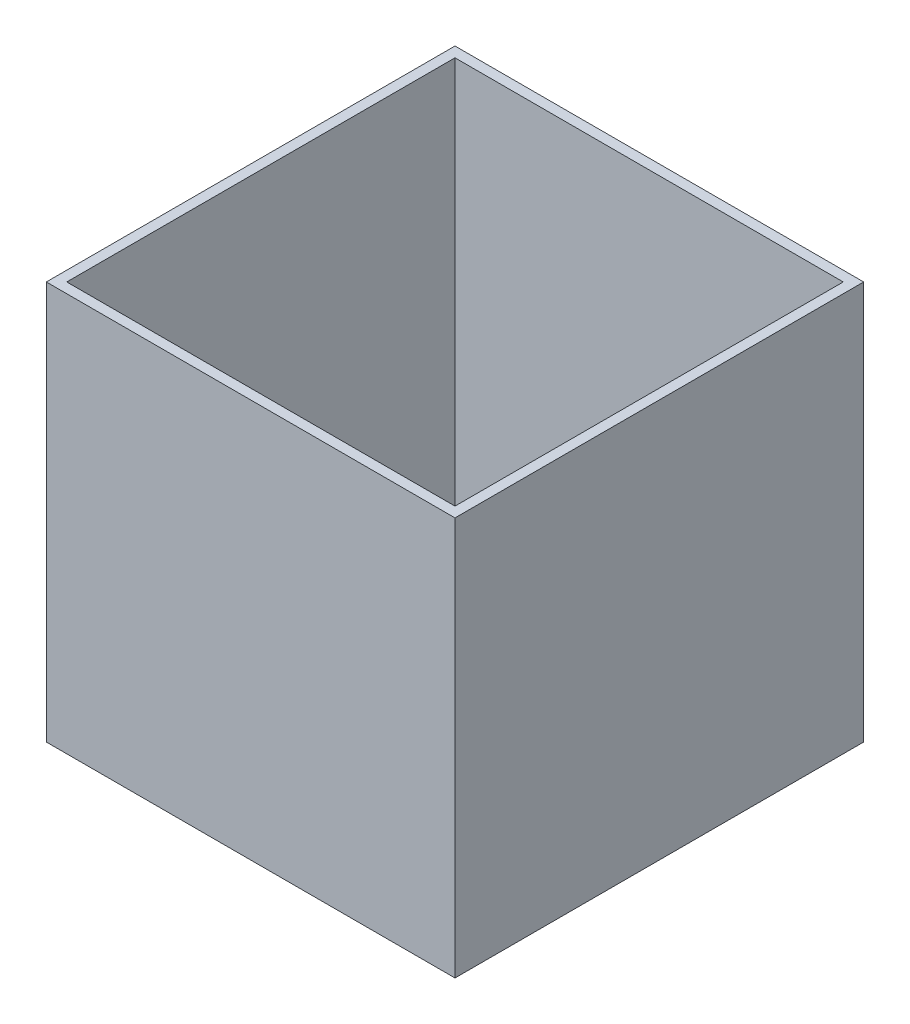
ISO-10303-21;
HEADER;
FILE_DESCRIPTION(('STEP AP214'),'2;1');
FILE_NAME('part.step','',(''),(''),'','','');
FILE_SCHEMA(('AUTOMOTIVE_DESIGN { 1 0 10303 214 1 1 1 1 }'));
ENDSEC;
DATA;
#1=APPLICATION_CONTEXT('core data for automotive mechanical design processes');
#2=APPLICATION_PROTOCOL_DEFINITION('international standard','automotive_design',2000,#1);
#3=PRODUCT_CONTEXT('',#1,'mechanical');
#4=PRODUCT('Part','Part','',(#3));
#5=PRODUCT_RELATED_PRODUCT_CATEGORY('part','',(#4));
#6=PRODUCT_DEFINITION_FORMATION('','',#4);
#7=PRODUCT_DEFINITION_CONTEXT('part definition',#1,'design');
#8=PRODUCT_DEFINITION('design','',#6,#7);
#9=PRODUCT_DEFINITION_SHAPE('','',#8);
#10=(LENGTH_UNIT() NAMED_UNIT(*) SI_UNIT(.MILLI.,.METRE.));
#11=(NAMED_UNIT(*) PLANE_ANGLE_UNIT() SI_UNIT($,.RADIAN.));
#12=(NAMED_UNIT(*) SI_UNIT($,.STERADIAN.) SOLID_ANGLE_UNIT());
#13=UNCERTAINTY_MEASURE_WITH_UNIT(LENGTH_MEASURE(1.E-05),#10,'distance_accuracy_value','');
#14=(GEOMETRIC_REPRESENTATION_CONTEXT(3) GLOBAL_UNCERTAINTY_ASSIGNED_CONTEXT((#13)) GLOBAL_UNIT_ASSIGNED_CONTEXT((#10,
#11,#12)) REPRESENTATION_CONTEXT('',''));
#15=CARTESIAN_POINT('',(0.,0.,0.));
#16=DIRECTION('',(0.,0.,1.));
#17=DIRECTION('',(1.,0.,0.));
#18=AXIS2_PLACEMENT_3D('',#15,#16,#17);
#19=CARTESIAN_POINT('',(40.,2.,-40.));
#20=DIRECTION('',(-1.,0.,0.));
#21=DIRECTION('',(0.,0.,1.));
#22=AXIS2_PLACEMENT_3D('',#19,#20,#21);
#23=PLANE('',#22);
#24=DIRECTION('',(0.,0.,-1.));
#25=VECTOR('',#24,1.);
#26=CARTESIAN_POINT('',(40.,0.,-40.));
#27=LINE('',#26,#25);
#28=CARTESIAN_POINT('',(40.,0.,40.));
#29=VERTEX_POINT('',#28);
#30=CARTESIAN_POINT('',(40.,0.,-40.));
#31=VERTEX_POINT('',#30);
#32=EDGE_CURVE('E210',#29,#31,#27,.T.);
#33=ORIENTED_EDGE('',*,*,#32,.T.);
#34=DIRECTION('',(0.,-1.,0.));
#35=VECTOR('',#34,1.);
#36=CARTESIAN_POINT('',(40.,-13.25,-40.));
#37=LINE('',#36,#35);
#38=CARTESIAN_POINT('',(40.,78.,-40.));
#39=VERTEX_POINT('',#38);
#40=EDGE_CURVE('E175',#39,#31,#37,.T.);
#41=ORIENTED_EDGE('',*,*,#40,.F.);
#42=DIRECTION('',(0.,0.,-1.));
#43=VECTOR('',#42,1.);
#44=CARTESIAN_POINT('',(40.,78.,-40.));
#45=LINE('',#44,#43);
#46=CARTESIAN_POINT('',(40.,78.,40.));
#47=VERTEX_POINT('',#46);
#48=EDGE_CURVE('E167',#47,#39,#45,.T.);
#49=ORIENTED_EDGE('',*,*,#48,.F.);
#50=DIRECTION('',(0.,-1.,0.));
#51=VECTOR('',#50,1.);
#52=CARTESIAN_POINT('',(40.,-13.25,40.));
#53=LINE('',#52,#51);
#54=EDGE_CURVE('E183',#47,#29,#53,.T.);
#55=ORIENTED_EDGE('',*,*,#54,.T.);
#56=EDGE_LOOP('',(#33,#41,#49,#55));
#57=FACE_BOUND('',#56,.T.);
#58=ADVANCED_FACE('F45',(#57),#23,.F.);
#59=CARTESIAN_POINT('',(0.,2.,0.));
#60=DIRECTION('',(0.,1.,0.));
#61=DIRECTION('',(0.,0.,1.));
#62=AXIS2_PLACEMENT_3D('',#59,#60,#61);
#63=PLANE('',#62);
#64=DIRECTION('',(0.,0.,1.));
#65=VECTOR('',#64,1.);
#66=CARTESIAN_POINT('',(-38.,2.,-38.));
#67=LINE('',#66,#65);
#68=CARTESIAN_POINT('',(-38.,2.,-38.));
#69=VERTEX_POINT('',#68);
#70=CARTESIAN_POINT('',(-38.,2.,38.));
#71=VERTEX_POINT('',#70);
#72=EDGE_CURVE('E62',#69,#71,#67,.T.);
#73=ORIENTED_EDGE('',*,*,#72,.T.);
#74=DIRECTION('',(1.,0.,0.));
#75=VECTOR('',#74,1.);
#76=CARTESIAN_POINT('',(38.,2.,38.));
#77=LINE('',#76,#75);
#78=CARTESIAN_POINT('',(38.,2.,38.));
#79=VERTEX_POINT('',#78);
#80=EDGE_CURVE('E66',#71,#79,#77,.T.);
#81=ORIENTED_EDGE('',*,*,#80,.T.);
#82=DIRECTION('',(0.,0.,-1.));
#83=VECTOR('',#82,1.);
#84=CARTESIAN_POINT('',(38.,2.,-38.));
#85=LINE('',#84,#83);
#86=CARTESIAN_POINT('',(38.,2.,-38.));
#87=VERTEX_POINT('',#86);
#88=EDGE_CURVE('E147',#79,#87,#85,.T.);
#89=ORIENTED_EDGE('',*,*,#88,.T.);
#90=DIRECTION('',(-1.,0.,0.));
#91=VECTOR('',#90,1.);
#92=CARTESIAN_POINT('',(38.,2.,-38.));
#93=LINE('',#92,#91);
#94=EDGE_CURVE('E122',#87,#69,#93,.T.);
#95=ORIENTED_EDGE('',*,*,#94,.T.);
#96=EDGE_LOOP('',(#73,#81,#89,#95));
#97=FACE_BOUND('',#96,.T.);
#98=CARTESIAN_POINT('',(-24.,2.,24.));
#99=DIRECTION('',(0.,-1.,0.));
#100=DIRECTION('',(0.,0.,-1.));
#101=AXIS2_PLACEMENT_3D('',#98,#99,#100);
#102=CIRCLE('',#101,2.2);
#103=CARTESIAN_POINT('',(-24.,2.,26.2));
#104=VERTEX_POINT('',#103);
#105=EDGE_CURVE('E189',#104,#104,#102,.T.);
#106=ORIENTED_EDGE('',*,*,#105,.T.);
#107=EDGE_LOOP('',(#106));
#108=FACE_BOUND('',#107,.T.);
#109=CARTESIAN_POINT('',(24.,2.,24.));
#110=DIRECTION('',(0.,-1.,0.));
#111=DIRECTION('',(0.,0.,-1.));
#112=AXIS2_PLACEMENT_3D('',#109,#110,#111);
#113=CIRCLE('',#112,2.2);
#114=CARTESIAN_POINT('',(24.,2.,26.2));
#115=VERTEX_POINT('',#114);
#116=EDGE_CURVE('E179',#115,#115,#113,.T.);
#117=ORIENTED_EDGE('',*,*,#116,.T.);
#118=EDGE_LOOP('',(#117));
#119=FACE_BOUND('',#118,.T.);
#120=CARTESIAN_POINT('',(-24.,2.,-24.));
#121=DIRECTION('',(0.,1.,0.));
#122=DIRECTION('',(0.,0.,1.));
#123=AXIS2_PLACEMENT_3D('',#120,#121,#122);
#124=CIRCLE('',#123,2.2);
#125=CARTESIAN_POINT('',(-24.,2.,-21.8));
#126=VERTEX_POINT('',#125);
#127=EDGE_CURVE('E197',#126,#126,#124,.T.);
#128=ORIENTED_EDGE('',*,*,#127,.F.);
#129=EDGE_LOOP('',(#128));
#130=FACE_BOUND('',#129,.T.);
#131=CARTESIAN_POINT('',(24.,2.,-24.));
#132=DIRECTION('',(0.,1.,0.));
#133=DIRECTION('',(0.,0.,1.));
#134=AXIS2_PLACEMENT_3D('',#131,#132,#133);
#135=CIRCLE('',#134,2.2);
#136=CARTESIAN_POINT('',(24.,2.,-21.8));
#137=VERTEX_POINT('',#136);
#138=EDGE_CURVE('E202',#137,#137,#135,.T.);
#139=ORIENTED_EDGE('',*,*,#138,.F.);
#140=EDGE_LOOP('',(#139));
#141=FACE_BOUND('',#140,.T.);
#142=CARTESIAN_POINT('',(0.,2.,0.));
#143=DIRECTION('',(0.,1.,0.));
#144=DIRECTION('',(0.,0.,1.));
#145=AXIS2_PLACEMENT_3D('',#142,#143,#144);
#146=CIRCLE('',#145,18.4);
#147=CARTESIAN_POINT('',(0.,2.,18.4));
#148=VERTEX_POINT('',#147);
#149=EDGE_CURVE('E206',#148,#148,#146,.T.);
#150=ORIENTED_EDGE('',*,*,#149,.F.);
#151=EDGE_LOOP('',(#150));
#152=FACE_BOUND('',#151,.T.);
#153=ADVANCED_FACE('F243',(#97,#108,#119,#130,#141,#152),#63,.T.);
#154=CARTESIAN_POINT('',(0.,0.,0.));
#155=DIRECTION('',(0.,1.,0.));
#156=DIRECTION('',(0.,0.,1.));
#157=AXIS2_PLACEMENT_3D('',#154,#155,#156);
#158=PLANE('',#157);
#159=CARTESIAN_POINT('',(-24.,0.,24.));
#160=DIRECTION('',(0.,1.,0.));
#161=DIRECTION('',(0.,0.,1.));
#162=AXIS2_PLACEMENT_3D('',#159,#160,#161);
#163=CIRCLE('',#162,2.2);
#164=CARTESIAN_POINT('',(-24.,0.,26.2));
#165=VERTEX_POINT('',#164);
#166=EDGE_CURVE('E48',#165,#165,#163,.F.);
#167=ORIENTED_EDGE('',*,*,#166,.F.);
#168=EDGE_LOOP('',(#167));
#169=FACE_BOUND('',#168,.T.);
#170=CARTESIAN_POINT('',(24.,0.,24.));
#171=DIRECTION('',(0.,1.,0.));
#172=DIRECTION('',(0.,0.,1.));
#173=AXIS2_PLACEMENT_3D('',#170,#171,#172);
#174=CIRCLE('',#173,2.2);
#175=CARTESIAN_POINT('',(24.,0.,26.2));
#176=VERTEX_POINT('',#175);
#177=EDGE_CURVE('E193',#176,#176,#174,.F.);
#178=ORIENTED_EDGE('',*,*,#177,.F.);
#179=EDGE_LOOP('',(#178));
#180=FACE_BOUND('',#179,.T.);
#181=CARTESIAN_POINT('',(-24.,0.,-24.));
#182=DIRECTION('',(0.,1.,0.));
#183=DIRECTION('',(0.,0.,1.));
#184=AXIS2_PLACEMENT_3D('',#181,#182,#183);
#185=CIRCLE('',#184,2.2);
#186=CARTESIAN_POINT('',(-24.,0.,-21.8));
#187=VERTEX_POINT('',#186);
#188=EDGE_CURVE('E215',#187,#187,#185,.T.);
#189=ORIENTED_EDGE('',*,*,#188,.T.);
#190=EDGE_LOOP('',(#189));
#191=FACE_BOUND('',#190,.T.);
#192=CARTESIAN_POINT('',(24.,0.,-24.));
#193=DIRECTION('',(0.,1.,0.));
#194=DIRECTION('',(0.,0.,1.));
#195=AXIS2_PLACEMENT_3D('',#192,#193,#194);
#196=CIRCLE('',#195,2.2);
#197=CARTESIAN_POINT('',(24.,0.,-21.8));
#198=VERTEX_POINT('',#197);
#199=EDGE_CURVE('E201',#198,#198,#196,.T.);
#200=ORIENTED_EDGE('',*,*,#199,.T.);
#201=EDGE_LOOP('',(#200));
#202=FACE_BOUND('',#201,.T.);
#203=ORIENTED_EDGE('',*,*,#32,.F.);
#204=DIRECTION('',(1.,0.,0.));
#205=VECTOR('',#204,1.);
#206=CARTESIAN_POINT('',(-40.,0.,40.));
#207=LINE('',#206,#205);
#208=CARTESIAN_POINT('',(-40.,0.,40.));
#209=VERTEX_POINT('',#208);
#210=EDGE_CURVE('E11',#209,#29,#207,.T.);
#211=ORIENTED_EDGE('',*,*,#210,.F.);
#212=DIRECTION('',(0.,0.,1.));
#213=VECTOR('',#212,1.);
#214=CARTESIAN_POINT('',(-40.,0.,-40.));
#215=LINE('',#214,#213);
#216=CARTESIAN_POINT('',(-40.,0.,-40.));
#217=VERTEX_POINT('',#216);
#218=EDGE_CURVE('E54',#217,#209,#215,.T.);
#219=ORIENTED_EDGE('',*,*,#218,.F.);
#220=DIRECTION('',(-1.,0.,0.));
#221=VECTOR('',#220,1.);
#222=CARTESIAN_POINT('',(-40.,0.,-40.));
#223=LINE('',#222,#221);
#224=EDGE_CURVE('E218',#31,#217,#223,.T.);
#225=ORIENTED_EDGE('',*,*,#224,.F.);
#226=EDGE_LOOP('',(#203,#211,#219,#225));
#227=FACE_BOUND('',#226,.T.);
#228=CARTESIAN_POINT('',(0.,0.,0.));
#229=DIRECTION('',(0.,1.,0.));
#230=DIRECTION('',(0.,0.,1.));
#231=AXIS2_PLACEMENT_3D('',#228,#229,#230);
#232=CIRCLE('',#231,18.4);
#233=CARTESIAN_POINT('',(0.,0.,18.4));
#234=VERTEX_POINT('',#233);
#235=EDGE_CURVE('E211',#234,#234,#232,.T.);
#236=ORIENTED_EDGE('',*,*,#235,.T.);
#237=EDGE_LOOP('',(#236));
#238=FACE_BOUND('',#237,.T.);
#239=ADVANCED_FACE('F239',(#169,#180,#191,#202,#227,#238),#158,.F.);
#240=CARTESIAN_POINT('',(-40.,2.,-40.));
#241=DIRECTION('',(0.,0.,1.));
#242=DIRECTION('',(1.,0.,0.));
#243=AXIS2_PLACEMENT_3D('',#240,#241,#242);
#244=PLANE('',#243);
#245=ORIENTED_EDGE('',*,*,#224,.T.);
#246=DIRECTION('',(0.,1.,0.));
#247=VECTOR('',#246,1.);
#248=CARTESIAN_POINT('',(-40.,-13.25,-40.));
#249=LINE('',#248,#247);
#250=CARTESIAN_POINT('',(-40.,78.,-40.));
#251=VERTEX_POINT('',#250);
#252=EDGE_CURVE('E176',#217,#251,#249,.T.);
#253=ORIENTED_EDGE('',*,*,#252,.T.);
#254=DIRECTION('',(-1.,0.,0.));
#255=VECTOR('',#254,1.);
#256=CARTESIAN_POINT('',(-40.,78.,-40.));
#257=LINE('',#256,#255);
#258=EDGE_CURVE('E171',#39,#251,#257,.T.);
#259=ORIENTED_EDGE('',*,*,#258,.F.);
#260=ORIENTED_EDGE('',*,*,#40,.T.);
#261=EDGE_LOOP('',(#245,#253,#259,#260));
#262=FACE_BOUND('',#261,.T.);
#263=ADVANCED_FACE('F242',(#262),#244,.F.);
#264=CARTESIAN_POINT('',(-40.,2.,-40.));
#265=DIRECTION('',(1.,0.,0.));
#266=DIRECTION('',(0.,0.,-1.));
#267=AXIS2_PLACEMENT_3D('',#264,#265,#266);
#268=PLANE('',#267);
#269=DIRECTION('',(0.,1.,0.));
#270=VECTOR('',#269,1.);
#271=CARTESIAN_POINT('',(-40.,-13.25,40.));
#272=LINE('',#271,#270);
#273=CARTESIAN_POINT('',(-40.,78.,40.));
#274=VERTEX_POINT('',#273);
#275=EDGE_CURVE('E180',#209,#274,#272,.T.);
#276=ORIENTED_EDGE('',*,*,#275,.T.);
#277=DIRECTION('',(0.,0.,1.));
#278=VECTOR('',#277,1.);
#279=CARTESIAN_POINT('',(-40.,78.,-40.));
#280=LINE('',#279,#278);
#281=EDGE_CURVE('E128',#251,#274,#280,.T.);
#282=ORIENTED_EDGE('',*,*,#281,.F.);
#283=ORIENTED_EDGE('',*,*,#252,.F.);
#284=ORIENTED_EDGE('',*,*,#218,.T.);
#285=EDGE_LOOP('',(#276,#282,#283,#284));
#286=FACE_BOUND('',#285,.T.);
#287=ADVANCED_FACE('F269',(#286),#268,.F.);
#288=CARTESIAN_POINT('',(-40.,2.,40.));
#289=DIRECTION('',(0.,0.,-1.));
#290=DIRECTION('',(-1.,0.,0.));
#291=AXIS2_PLACEMENT_3D('',#288,#289,#290);
#292=PLANE('',#291);
#293=ORIENTED_EDGE('',*,*,#54,.F.);
#294=DIRECTION('',(1.,0.,0.));
#295=VECTOR('',#294,1.);
#296=CARTESIAN_POINT('',(-40.,78.,40.));
#297=LINE('',#296,#295);
#298=EDGE_CURVE('E163',#274,#47,#297,.T.);
#299=ORIENTED_EDGE('',*,*,#298,.F.);
#300=ORIENTED_EDGE('',*,*,#275,.F.);
#301=ORIENTED_EDGE('',*,*,#210,.T.);
#302=EDGE_LOOP('',(#293,#299,#300,#301));
#303=FACE_BOUND('',#302,.T.);
#304=ADVANCED_FACE('F259',(#303),#292,.F.);
#305=CARTESIAN_POINT('',(0.,2.,0.));
#306=DIRECTION('',(0.,-1.,0.));
#307=DIRECTION('',(0.,0.,-1.));
#308=AXIS2_PLACEMENT_3D('',#305,#306,#307);
#309=CYLINDRICAL_SURFACE('',#308,18.4);
#310=ORIENTED_EDGE('',*,*,#149,.T.);
#311=EDGE_LOOP('',(#310));
#312=FACE_BOUND('',#311,.T.);
#313=ORIENTED_EDGE('',*,*,#235,.F.);
#314=EDGE_LOOP('',(#313));
#315=FACE_BOUND('',#314,.T.);
#316=ADVANCED_FACE('F256',(#312,#315),#309,.F.);
#317=CARTESIAN_POINT('',(24.,-13.25,-24.));
#318=DIRECTION('',(0.,1.,0.));
#319=DIRECTION('',(0.,0.,1.));
#320=AXIS2_PLACEMENT_3D('',#317,#318,#319);
#321=CYLINDRICAL_SURFACE('',#320,2.2);
#322=CARTESIAN_POINT('',(24.,2.,-21.8));
#323=CARTESIAN_POINT('',(24.,1.97916666666667,-21.8));
#324=CARTESIAN_POINT('',(24.,1.95833333333333,-21.8));
#325=CARTESIAN_POINT('',(24.,1.91666666666666,-21.8));
#326=CARTESIAN_POINT('',(24.,1.89583333333333,-21.8));
#327=CARTESIAN_POINT('',(24.,1.85416666666666,-21.8));
#328=CARTESIAN_POINT('',(24.,1.83333333333333,-21.8));
#329=CARTESIAN_POINT('',(24.,1.79166666666666,-21.8));
#330=CARTESIAN_POINT('',(24.,1.77083333333333,-21.8));
#331=CARTESIAN_POINT('',(24.,1.72916666666666,-21.8));
#332=CARTESIAN_POINT('',(24.,1.70833333333333,-21.8));
#333=CARTESIAN_POINT('',(24.,1.66666666666666,-21.8));
#334=CARTESIAN_POINT('',(24.,1.64583333333333,-21.8));
#335=CARTESIAN_POINT('',(24.,1.60416666666666,-21.8));
#336=CARTESIAN_POINT('',(24.,1.58333333333333,-21.8));
#337=CARTESIAN_POINT('',(24.,1.54166666666666,-21.8));
#338=CARTESIAN_POINT('',(24.,1.52083333333333,-21.8));
#339=CARTESIAN_POINT('',(24.,1.47916666666667,-21.8));
#340=CARTESIAN_POINT('',(24.,1.45833333333333,-21.8));
#341=CARTESIAN_POINT('',(24.,1.41666666666667,-21.8));
#342=CARTESIAN_POINT('',(24.,1.39583333333333,-21.8));
#343=CARTESIAN_POINT('',(24.,1.35416666666667,-21.8));
#344=CARTESIAN_POINT('',(24.,1.33333333333333,-21.8));
#345=CARTESIAN_POINT('',(24.,1.29166666666667,-21.8));
#346=CARTESIAN_POINT('',(24.,1.27083333333333,-21.8));
#347=CARTESIAN_POINT('',(24.,1.22916666666667,-21.8));
#348=CARTESIAN_POINT('',(24.,1.20833333333333,-21.8));
#349=CARTESIAN_POINT('',(24.,1.16666666666667,-21.8));
#350=CARTESIAN_POINT('',(24.,1.14583333333333,-21.8));
#351=CARTESIAN_POINT('',(24.,1.10416666666667,-21.8));
#352=CARTESIAN_POINT('',(24.,1.08333333333333,-21.8));
#353=CARTESIAN_POINT('',(24.,1.04166666666667,-21.8));
#354=CARTESIAN_POINT('',(24.,1.02083333333333,-21.8));
#355=CARTESIAN_POINT('',(24.,0.979166666666666,-21.8));
#356=CARTESIAN_POINT('',(24.,0.958333333333332,-21.8));
#357=CARTESIAN_POINT('',(24.,0.916666666666666,-21.8));
#358=CARTESIAN_POINT('',(24.,0.895833333333332,-21.8));
#359=CARTESIAN_POINT('',(24.,0.854166666666666,-21.8));
#360=CARTESIAN_POINT('',(24.,0.833333333333332,-21.8));
#361=CARTESIAN_POINT('',(24.,0.791666666666666,-21.8));
#362=CARTESIAN_POINT('',(24.,0.770833333333332,-21.8));
#363=CARTESIAN_POINT('',(24.,0.729166666666666,-21.8));
#364=CARTESIAN_POINT('',(24.,0.708333333333332,-21.8));
#365=CARTESIAN_POINT('',(24.,0.666666666666666,-21.8));
#366=CARTESIAN_POINT('',(24.,0.645833333333332,-21.8));
#367=CARTESIAN_POINT('',(24.,0.604166666666666,-21.8));
#368=CARTESIAN_POINT('',(24.,0.583333333333333,-21.8));
#369=CARTESIAN_POINT('',(24.,0.541666666666667,-21.8));
#370=CARTESIAN_POINT('',(24.,0.520833333333334,-21.8));
#371=CARTESIAN_POINT('',(24.,0.479166666666667,-21.8));
#372=CARTESIAN_POINT('',(24.,0.458333333333334,-21.8));
#373=CARTESIAN_POINT('',(24.,0.416666666666667,-21.8));
#374=CARTESIAN_POINT('',(24.,0.395833333333334,-21.8));
#375=CARTESIAN_POINT('',(24.,0.354166666666667,-21.8));
#376=CARTESIAN_POINT('',(24.,0.333333333333334,-21.8));
#377=CARTESIAN_POINT('',(24.,0.291666666666667,-21.8));
#378=CARTESIAN_POINT('',(24.,0.270833333333334,-21.8));
#379=CARTESIAN_POINT('',(24.,0.229166666666667,-21.8));
#380=CARTESIAN_POINT('',(24.,0.208333333333334,-21.8));
#381=CARTESIAN_POINT('',(24.,0.166666666666667,-21.8));
#382=CARTESIAN_POINT('',(24.,0.145833333333333,-21.8));
#383=CARTESIAN_POINT('',(24.,0.104166666666667,-21.8));
#384=CARTESIAN_POINT('',(24.,0.0833333333333334,-21.8));
#385=CARTESIAN_POINT('',(24.,0.0416666666666667,-21.8));
#386=CARTESIAN_POINT('',(24.,0.0208333333333333,-21.8));
#387=CARTESIAN_POINT('',(24.,0.,-21.8));
#388=B_SPLINE_CURVE_WITH_KNOTS('',3,(#322,#323,#324,#325,#326,#327,#328,#329,#330,#331,#332,
#333,#334,#335,#336,#337,#338,#339,#340,#341,#342,#343,#344,#345,#346,#347,#348,#349,#350,#351,
#352,#353,#354,#355,#356,#357,#358,#359,#360,#361,#362,#363,#364,#365,#366,#367,#368,#369,#370,
#371,#372,#373,#374,#375,#376,#377,#378,#379,#380,#381,#382,#383,#384,#385,#386,#387),
.UNSPECIFIED.,.F.,.F.,(4,2,2,2,2,2,2,2,2,2,2,2,2,2,2,2,2,2,2,2,2,2,2,2,2,2,2,2,2,2,2,2,4),(0.,
0.0625000000000001,0.125,0.1875,0.25,0.3125,0.375,0.4375,0.5,0.562499999999999,
0.624999999999999,0.687499999999999,0.749999999999999,0.812499999999999,0.874999999999999,
0.937499999999999,0.999999999999999,1.0625,1.125,1.1875,1.25,1.3125,1.375,1.4375,1.5,1.5625,
1.625,1.6875,1.75,1.8125,1.875,1.9375,2.),.UNSPECIFIED.);
#389=EDGE_CURVE('BSEAM258',#137,#198,#388,.T.);
#390=ORIENTED_EDGE('',*,*,#138,.T.);
#391=ORIENTED_EDGE('',*,*,#199,.F.);
#392=ORIENTED_EDGE('',*,*,#389,.T.);
#393=ORIENTED_EDGE('',*,*,#389,.F.);
#394=EDGE_LOOP('',(#390,#392,#391,#393));
#395=FACE_BOUND('',#394,.T.);
#396=ADVANCED_FACE('F258',(#395),#321,.F.);
#397=CARTESIAN_POINT('',(-24.,-13.25,-24.));
#398=DIRECTION('',(0.,1.,0.));
#399=DIRECTION('',(0.,0.,1.));
#400=AXIS2_PLACEMENT_3D('',#397,#398,#399);
#401=CYLINDRICAL_SURFACE('',#400,2.2);
#402=CARTESIAN_POINT('',(-24.,2.,-21.8));
#403=CARTESIAN_POINT('',(-24.,1.97916666666667,-21.8));
#404=CARTESIAN_POINT('',(-24.,1.95833333333333,-21.8));
#405=CARTESIAN_POINT('',(-24.,1.91666666666666,-21.8));
#406=CARTESIAN_POINT('',(-24.,1.89583333333333,-21.8));
#407=CARTESIAN_POINT('',(-24.,1.85416666666666,-21.8));
#408=CARTESIAN_POINT('',(-24.,1.83333333333333,-21.8));
#409=CARTESIAN_POINT('',(-24.,1.79166666666666,-21.8));
#410=CARTESIAN_POINT('',(-24.,1.77083333333333,-21.8));
#411=CARTESIAN_POINT('',(-24.,1.72916666666666,-21.8));
#412=CARTESIAN_POINT('',(-24.,1.70833333333333,-21.8));
#413=CARTESIAN_POINT('',(-24.,1.66666666666666,-21.8));
#414=CARTESIAN_POINT('',(-24.,1.64583333333333,-21.8));
#415=CARTESIAN_POINT('',(-24.,1.60416666666666,-21.8));
#416=CARTESIAN_POINT('',(-24.,1.58333333333333,-21.8));
#417=CARTESIAN_POINT('',(-24.,1.54166666666666,-21.8));
#418=CARTESIAN_POINT('',(-24.,1.52083333333333,-21.8));
#419=CARTESIAN_POINT('',(-24.,1.47916666666667,-21.8));
#420=CARTESIAN_POINT('',(-24.,1.45833333333333,-21.8));
#421=CARTESIAN_POINT('',(-24.,1.41666666666667,-21.8));
#422=CARTESIAN_POINT('',(-24.,1.39583333333333,-21.8));
#423=CARTESIAN_POINT('',(-24.,1.35416666666667,-21.8));
#424=CARTESIAN_POINT('',(-24.,1.33333333333333,-21.8));
#425=CARTESIAN_POINT('',(-24.,1.29166666666667,-21.8));
#426=CARTESIAN_POINT('',(-24.,1.27083333333333,-21.8));
#427=CARTESIAN_POINT('',(-24.,1.22916666666667,-21.8));
#428=CARTESIAN_POINT('',(-24.,1.20833333333333,-21.8));
#429=CARTESIAN_POINT('',(-24.,1.16666666666667,-21.8));
#430=CARTESIAN_POINT('',(-24.,1.14583333333333,-21.8));
#431=CARTESIAN_POINT('',(-24.,1.10416666666667,-21.8));
#432=CARTESIAN_POINT('',(-24.,1.08333333333333,-21.8));
#433=CARTESIAN_POINT('',(-24.,1.04166666666667,-21.8));
#434=CARTESIAN_POINT('',(-24.,1.02083333333333,-21.8));
#435=CARTESIAN_POINT('',(-24.,0.979166666666666,-21.8));
#436=CARTESIAN_POINT('',(-24.,0.958333333333332,-21.8));
#437=CARTESIAN_POINT('',(-24.,0.916666666666666,-21.8));
#438=CARTESIAN_POINT('',(-24.,0.895833333333332,-21.8));
#439=CARTESIAN_POINT('',(-24.,0.854166666666666,-21.8));
#440=CARTESIAN_POINT('',(-24.,0.833333333333332,-21.8));
#441=CARTESIAN_POINT('',(-24.,0.791666666666666,-21.8));
#442=CARTESIAN_POINT('',(-24.,0.770833333333332,-21.8));
#443=CARTESIAN_POINT('',(-24.,0.729166666666666,-21.8));
#444=CARTESIAN_POINT('',(-24.,0.708333333333332,-21.8));
#445=CARTESIAN_POINT('',(-24.,0.666666666666666,-21.8));
#446=CARTESIAN_POINT('',(-24.,0.645833333333332,-21.8));
#447=CARTESIAN_POINT('',(-24.,0.604166666666666,-21.8));
#448=CARTESIAN_POINT('',(-24.,0.583333333333333,-21.8));
#449=CARTESIAN_POINT('',(-24.,0.541666666666667,-21.8));
#450=CARTESIAN_POINT('',(-24.,0.520833333333334,-21.8));
#451=CARTESIAN_POINT('',(-24.,0.479166666666667,-21.8));
#452=CARTESIAN_POINT('',(-24.,0.458333333333334,-21.8));
#453=CARTESIAN_POINT('',(-24.,0.416666666666667,-21.8));
#454=CARTESIAN_POINT('',(-24.,0.395833333333334,-21.8));
#455=CARTESIAN_POINT('',(-24.,0.354166666666667,-21.8));
#456=CARTESIAN_POINT('',(-24.,0.333333333333334,-21.8));
#457=CARTESIAN_POINT('',(-24.,0.291666666666667,-21.8));
#458=CARTESIAN_POINT('',(-24.,0.270833333333334,-21.8));
#459=CARTESIAN_POINT('',(-24.,0.229166666666667,-21.8));
#460=CARTESIAN_POINT('',(-24.,0.208333333333334,-21.8));
#461=CARTESIAN_POINT('',(-24.,0.166666666666667,-21.8));
#462=CARTESIAN_POINT('',(-24.,0.145833333333333,-21.8));
#463=CARTESIAN_POINT('',(-24.,0.104166666666667,-21.8));
#464=CARTESIAN_POINT('',(-24.,0.0833333333333334,-21.8));
#465=CARTESIAN_POINT('',(-24.,0.0416666666666667,-21.8));
#466=CARTESIAN_POINT('',(-24.,0.0208333333333333,-21.8));
#467=CARTESIAN_POINT('',(-24.,0.,-21.8));
#468=B_SPLINE_CURVE_WITH_KNOTS('',3,(#402,#403,#404,#405,#406,#407,#408,#409,#410,#411,#412,
#413,#414,#415,#416,#417,#418,#419,#420,#421,#422,#423,#424,#425,#426,#427,#428,#429,#430,#431,
#432,#433,#434,#435,#436,#437,#438,#439,#440,#441,#442,#443,#444,#445,#446,#447,#448,#449,#450,
#451,#452,#453,#454,#455,#456,#457,#458,#459,#460,#461,#462,#463,#464,#465,#466,#467),
.UNSPECIFIED.,.F.,.F.,(4,2,2,2,2,2,2,2,2,2,2,2,2,2,2,2,2,2,2,2,2,2,2,2,2,2,2,2,2,2,2,2,4),(0.,
0.0625000000000001,0.125,0.1875,0.25,0.3125,0.375,0.4375,0.5,0.562499999999999,
0.624999999999999,0.687499999999999,0.749999999999999,0.812499999999999,0.874999999999999,
0.937499999999999,0.999999999999999,1.0625,1.125,1.1875,1.25,1.3125,1.375,1.4375,1.5,1.5625,
1.625,1.6875,1.75,1.8125,1.875,1.9375,2.),.UNSPECIFIED.);
#469=EDGE_CURVE('BSEAM265',#126,#187,#468,.T.);
#470=ORIENTED_EDGE('',*,*,#127,.T.);
#471=ORIENTED_EDGE('',*,*,#188,.F.);
#472=ORIENTED_EDGE('',*,*,#469,.T.);
#473=ORIENTED_EDGE('',*,*,#469,.F.);
#474=EDGE_LOOP('',(#470,#472,#471,#473));
#475=FACE_BOUND('',#474,.T.);
#476=ADVANCED_FACE('F265',(#475),#401,.F.);
#477=CARTESIAN_POINT('',(24.,-13.25,24.));
#478=DIRECTION('',(0.,1.,0.));
#479=DIRECTION('',(0.,0.,1.));
#480=AXIS2_PLACEMENT_3D('',#477,#478,#479);
#481=CYLINDRICAL_SURFACE('',#480,2.2);
#482=CARTESIAN_POINT('',(24.,2.,26.2));
#483=CARTESIAN_POINT('',(24.,1.97916666666667,26.2));
#484=CARTESIAN_POINT('',(24.,1.95833333333334,26.2));
#485=CARTESIAN_POINT('',(24.,1.91666666666667,26.2));
#486=CARTESIAN_POINT('',(24.,1.89583333333334,26.2));
#487=CARTESIAN_POINT('',(24.,1.85416666666667,26.2));
#488=CARTESIAN_POINT('',(24.,1.83333333333334,26.2));
#489=CARTESIAN_POINT('',(24.,1.79166666666667,26.2));
#490=CARTESIAN_POINT('',(24.,1.77083333333334,26.2));
#491=CARTESIAN_POINT('',(24.,1.72916666666667,26.2));
#492=CARTESIAN_POINT('',(24.,1.70833333333333,26.2));
#493=CARTESIAN_POINT('',(24.,1.66666666666667,26.2));
#494=CARTESIAN_POINT('',(24.,1.64583333333333,26.2));
#495=CARTESIAN_POINT('',(24.,1.60416666666667,26.2));
#496=CARTESIAN_POINT('',(24.,1.58333333333333,26.2));
#497=CARTESIAN_POINT('',(24.,1.54166666666667,26.2));
#498=CARTESIAN_POINT('',(24.,1.52083333333333,26.2));
#499=CARTESIAN_POINT('',(24.,1.47916666666667,26.2));
#500=CARTESIAN_POINT('',(24.,1.45833333333333,26.2));
#501=CARTESIAN_POINT('',(24.,1.41666666666667,26.2));
#502=CARTESIAN_POINT('',(24.,1.39583333333333,26.2));
#503=CARTESIAN_POINT('',(24.,1.35416666666667,26.2));
#504=CARTESIAN_POINT('',(24.,1.33333333333333,26.2));
#505=CARTESIAN_POINT('',(24.,1.29166666666667,26.2));
#506=CARTESIAN_POINT('',(24.,1.27083333333333,26.2));
#507=CARTESIAN_POINT('',(24.,1.22916666666667,26.2));
#508=CARTESIAN_POINT('',(24.,1.20833333333333,26.2));
#509=CARTESIAN_POINT('',(24.,1.16666666666667,26.2));
#510=CARTESIAN_POINT('',(24.,1.14583333333333,26.2));
#511=CARTESIAN_POINT('',(24.,1.10416666666667,26.2));
#512=CARTESIAN_POINT('',(24.,1.08333333333333,26.2));
#513=CARTESIAN_POINT('',(24.,1.04166666666667,26.2));
#514=CARTESIAN_POINT('',(24.,1.02083333333333,26.2));
#515=CARTESIAN_POINT('',(24.,0.979166666666668,26.2));
#516=CARTESIAN_POINT('',(24.,0.958333333333334,26.2));
#517=CARTESIAN_POINT('',(24.,0.916666666666668,26.2));
#518=CARTESIAN_POINT('',(24.,0.895833333333334,26.2));
#519=CARTESIAN_POINT('',(24.,0.854166666666667,26.2));
#520=CARTESIAN_POINT('',(24.,0.833333333333334,26.2));
#521=CARTESIAN_POINT('',(24.,0.791666666666667,26.2));
#522=CARTESIAN_POINT('',(24.,0.770833333333334,26.2));
#523=CARTESIAN_POINT('',(24.,0.729166666666667,26.2));
#524=CARTESIAN_POINT('',(24.,0.708333333333334,26.2));
#525=CARTESIAN_POINT('',(24.,0.666666666666667,26.2));
#526=CARTESIAN_POINT('',(24.,0.645833333333334,26.2));
#527=CARTESIAN_POINT('',(24.,0.604166666666667,26.2));
#528=CARTESIAN_POINT('',(24.,0.583333333333334,26.2));
#529=CARTESIAN_POINT('',(24.,0.541666666666667,26.2));
#530=CARTESIAN_POINT('',(24.,0.520833333333334,26.2));
#531=CARTESIAN_POINT('',(24.,0.479166666666667,26.2));
#532=CARTESIAN_POINT('',(24.,0.458333333333334,26.2));
#533=CARTESIAN_POINT('',(24.,0.416666666666667,26.2));
#534=CARTESIAN_POINT('',(24.,0.395833333333334,26.2));
#535=CARTESIAN_POINT('',(24.,0.354166666666667,26.2));
#536=CARTESIAN_POINT('',(24.,0.333333333333334,26.2));
#537=CARTESIAN_POINT('',(24.,0.291666666666667,26.2));
#538=CARTESIAN_POINT('',(24.,0.270833333333334,26.2));
#539=CARTESIAN_POINT('',(24.,0.229166666666667,26.2));
#540=CARTESIAN_POINT('',(24.,0.208333333333334,26.2));
#541=CARTESIAN_POINT('',(24.,0.166666666666667,26.2));
#542=CARTESIAN_POINT('',(24.,0.145833333333333,26.2));
#543=CARTESIAN_POINT('',(24.,0.104166666666667,26.2));
#544=CARTESIAN_POINT('',(24.,0.0833333333333334,26.2));
#545=CARTESIAN_POINT('',(24.,0.0416666666666667,26.2));
#546=CARTESIAN_POINT('',(24.,0.0208333333333333,26.2));
#547=CARTESIAN_POINT('',(24.,0.,26.2));
#548=B_SPLINE_CURVE_WITH_KNOTS('',3,(#482,#483,#484,#485,#486,#487,#488,#489,#490,#491,#492,
#493,#494,#495,#496,#497,#498,#499,#500,#501,#502,#503,#504,#505,#506,#507,#508,#509,#510,#511,
#512,#513,#514,#515,#516,#517,#518,#519,#520,#521,#522,#523,#524,#525,#526,#527,#528,#529,#530,
#531,#532,#533,#534,#535,#536,#537,#538,#539,#540,#541,#542,#543,#544,#545,#546,#547),
.UNSPECIFIED.,.F.,.F.,(4,2,2,2,2,2,2,2,2,2,2,2,2,2,2,2,2,2,2,2,2,2,2,2,2,2,2,2,2,2,2,2,4),(0.,
0.0625000000000001,0.125,0.1875,0.25,0.3125,0.375,0.4375,0.5,0.5625,0.625000000000001,
0.687500000000001,0.750000000000001,0.812500000000001,0.875000000000001,0.937500000000001,1.,
1.0625,1.125,1.1875,1.25,1.3125,1.375,1.4375,1.5,1.5625,1.625,1.6875,1.75,1.8125,1.875,1.9375,
2.),.UNSPECIFIED.);
#549=EDGE_CURVE('BSEAM294',#115,#176,#548,.T.);
#550=ORIENTED_EDGE('',*,*,#116,.F.);
#551=ORIENTED_EDGE('',*,*,#177,.T.);
#552=ORIENTED_EDGE('',*,*,#549,.T.);
#553=ORIENTED_EDGE('',*,*,#549,.F.);
#554=EDGE_LOOP('',(#550,#552,#551,#553));
#555=FACE_BOUND('',#554,.T.);
#556=ADVANCED_FACE('F294',(#555),#481,.F.);
#557=CARTESIAN_POINT('',(-24.,-13.25,24.));
#558=DIRECTION('',(0.,1.,0.));
#559=DIRECTION('',(0.,0.,1.));
#560=AXIS2_PLACEMENT_3D('',#557,#558,#559);
#561=CYLINDRICAL_SURFACE('',#560,2.2);
#562=CARTESIAN_POINT('',(-24.,2.,26.2));
#563=CARTESIAN_POINT('',(-24.,1.97916666666667,26.2));
#564=CARTESIAN_POINT('',(-24.,1.95833333333334,26.2));
#565=CARTESIAN_POINT('',(-24.,1.91666666666667,26.2));
#566=CARTESIAN_POINT('',(-24.,1.89583333333334,26.2));
#567=CARTESIAN_POINT('',(-24.,1.85416666666667,26.2));
#568=CARTESIAN_POINT('',(-24.,1.83333333333334,26.2));
#569=CARTESIAN_POINT('',(-24.,1.79166666666667,26.2));
#570=CARTESIAN_POINT('',(-24.,1.77083333333334,26.2));
#571=CARTESIAN_POINT('',(-24.,1.72916666666667,26.2));
#572=CARTESIAN_POINT('',(-24.,1.70833333333333,26.2));
#573=CARTESIAN_POINT('',(-24.,1.66666666666667,26.2));
#574=CARTESIAN_POINT('',(-24.,1.64583333333333,26.2));
#575=CARTESIAN_POINT('',(-24.,1.60416666666667,26.2));
#576=CARTESIAN_POINT('',(-24.,1.58333333333333,26.2));
#577=CARTESIAN_POINT('',(-24.,1.54166666666667,26.2));
#578=CARTESIAN_POINT('',(-24.,1.52083333333333,26.2));
#579=CARTESIAN_POINT('',(-24.,1.47916666666667,26.2));
#580=CARTESIAN_POINT('',(-24.,1.45833333333333,26.2));
#581=CARTESIAN_POINT('',(-24.,1.41666666666667,26.2));
#582=CARTESIAN_POINT('',(-24.,1.39583333333333,26.2));
#583=CARTESIAN_POINT('',(-24.,1.35416666666667,26.2));
#584=CARTESIAN_POINT('',(-24.,1.33333333333333,26.2));
#585=CARTESIAN_POINT('',(-24.,1.29166666666667,26.2));
#586=CARTESIAN_POINT('',(-24.,1.27083333333333,26.2));
#587=CARTESIAN_POINT('',(-24.,1.22916666666667,26.2));
#588=CARTESIAN_POINT('',(-24.,1.20833333333333,26.2));
#589=CARTESIAN_POINT('',(-24.,1.16666666666667,26.2));
#590=CARTESIAN_POINT('',(-24.,1.14583333333333,26.2));
#591=CARTESIAN_POINT('',(-24.,1.10416666666667,26.2));
#592=CARTESIAN_POINT('',(-24.,1.08333333333333,26.2));
#593=CARTESIAN_POINT('',(-24.,1.04166666666667,26.2));
#594=CARTESIAN_POINT('',(-24.,1.02083333333333,26.2));
#595=CARTESIAN_POINT('',(-24.,0.979166666666668,26.2));
#596=CARTESIAN_POINT('',(-24.,0.958333333333334,26.2));
#597=CARTESIAN_POINT('',(-24.,0.916666666666668,26.2));
#598=CARTESIAN_POINT('',(-24.,0.895833333333334,26.2));
#599=CARTESIAN_POINT('',(-24.,0.854166666666667,26.2));
#600=CARTESIAN_POINT('',(-24.,0.833333333333334,26.2));
#601=CARTESIAN_POINT('',(-24.,0.791666666666667,26.2));
#602=CARTESIAN_POINT('',(-24.,0.770833333333334,26.2));
#603=CARTESIAN_POINT('',(-24.,0.729166666666667,26.2));
#604=CARTESIAN_POINT('',(-24.,0.708333333333334,26.2));
#605=CARTESIAN_POINT('',(-24.,0.666666666666667,26.2));
#606=CARTESIAN_POINT('',(-24.,0.645833333333334,26.2));
#607=CARTESIAN_POINT('',(-24.,0.604166666666667,26.2));
#608=CARTESIAN_POINT('',(-24.,0.583333333333334,26.2));
#609=CARTESIAN_POINT('',(-24.,0.541666666666667,26.2));
#610=CARTESIAN_POINT('',(-24.,0.520833333333334,26.2));
#611=CARTESIAN_POINT('',(-24.,0.479166666666667,26.2));
#612=CARTESIAN_POINT('',(-24.,0.458333333333334,26.2));
#613=CARTESIAN_POINT('',(-24.,0.416666666666667,26.2));
#614=CARTESIAN_POINT('',(-24.,0.395833333333334,26.2));
#615=CARTESIAN_POINT('',(-24.,0.354166666666667,26.2));
#616=CARTESIAN_POINT('',(-24.,0.333333333333334,26.2));
#617=CARTESIAN_POINT('',(-24.,0.291666666666667,26.2));
#618=CARTESIAN_POINT('',(-24.,0.270833333333334,26.2));
#619=CARTESIAN_POINT('',(-24.,0.229166666666667,26.2));
#620=CARTESIAN_POINT('',(-24.,0.208333333333334,26.2));
#621=CARTESIAN_POINT('',(-24.,0.166666666666667,26.2));
#622=CARTESIAN_POINT('',(-24.,0.145833333333333,26.2));
#623=CARTESIAN_POINT('',(-24.,0.104166666666667,26.2));
#624=CARTESIAN_POINT('',(-24.,0.0833333333333334,26.2));
#625=CARTESIAN_POINT('',(-24.,0.0416666666666667,26.2));
#626=CARTESIAN_POINT('',(-24.,0.0208333333333333,26.2));
#627=CARTESIAN_POINT('',(-24.,0.,26.2));
#628=B_SPLINE_CURVE_WITH_KNOTS('',3,(#562,#563,#564,#565,#566,#567,#568,#569,#570,#571,#572,
#573,#574,#575,#576,#577,#578,#579,#580,#581,#582,#583,#584,#585,#586,#587,#588,#589,#590,#591,
#592,#593,#594,#595,#596,#597,#598,#599,#600,#601,#602,#603,#604,#605,#606,#607,#608,#609,#610,
#611,#612,#613,#614,#615,#616,#617,#618,#619,#620,#621,#622,#623,#624,#625,#626,#627),
.UNSPECIFIED.,.F.,.F.,(4,2,2,2,2,2,2,2,2,2,2,2,2,2,2,2,2,2,2,2,2,2,2,2,2,2,2,2,2,2,2,2,4),(0.,
0.0625000000000001,0.125,0.1875,0.25,0.3125,0.375,0.4375,0.5,0.5625,0.625000000000001,
0.687500000000001,0.750000000000001,0.812500000000001,0.875000000000001,0.937500000000001,1.,
1.0625,1.125,1.1875,1.25,1.3125,1.375,1.4375,1.5,1.5625,1.625,1.6875,1.75,1.8125,1.875,1.9375,
2.),.UNSPECIFIED.);
#629=EDGE_CURVE('BSEAM237',#104,#165,#628,.T.);
#630=ORIENTED_EDGE('',*,*,#105,.F.);
#631=ORIENTED_EDGE('',*,*,#166,.T.);
#632=ORIENTED_EDGE('',*,*,#629,.T.);
#633=ORIENTED_EDGE('',*,*,#629,.F.);
#634=EDGE_LOOP('',(#630,#632,#631,#633));
#635=FACE_BOUND('',#634,.T.);
#636=ADVANCED_FACE('F237',(#635),#561,.F.);
#637=CARTESIAN_POINT('',(0.,78.,0.));
#638=DIRECTION('',(0.,1.,0.));
#639=DIRECTION('',(0.,0.,1.));
#640=AXIS2_PLACEMENT_3D('',#637,#638,#639);
#641=PLANE('',#640);
#642=ORIENTED_EDGE('',*,*,#281,.T.);
#643=ORIENTED_EDGE('',*,*,#298,.T.);
#644=ORIENTED_EDGE('',*,*,#48,.T.);
#645=ORIENTED_EDGE('',*,*,#258,.T.);
#646=EDGE_LOOP('',(#642,#643,#644,#645));
#647=FACE_BOUND('',#646,.T.);
#648=DIRECTION('',(1.,0.,0.));
#649=VECTOR('',#648,1.);
#650=CARTESIAN_POINT('',(38.,78.,38.));
#651=LINE('',#650,#649);
#652=CARTESIAN_POINT('',(-38.,78.,38.));
#653=VERTEX_POINT('',#652);
#654=CARTESIAN_POINT('',(38.,78.,38.));
#655=VERTEX_POINT('',#654);
#656=EDGE_CURVE('E121',#653,#655,#651,.T.);
#657=ORIENTED_EDGE('',*,*,#656,.F.);
#658=DIRECTION('',(0.,0.,1.));
#659=VECTOR('',#658,1.);
#660=CARTESIAN_POINT('',(-38.,78.,-38.));
#661=LINE('',#660,#659);
#662=CARTESIAN_POINT('',(-38.,78.,-38.));
#663=VERTEX_POINT('',#662);
#664=EDGE_CURVE('E111',#663,#653,#661,.T.);
#665=ORIENTED_EDGE('',*,*,#664,.F.);
#666=DIRECTION('',(-1.,0.,0.));
#667=VECTOR('',#666,1.);
#668=CARTESIAN_POINT('',(38.,78.,-38.));
#669=LINE('',#668,#667);
#670=CARTESIAN_POINT('',(38.,78.,-38.));
#671=VERTEX_POINT('',#670);
#672=EDGE_CURVE('E138',#671,#663,#669,.T.);
#673=ORIENTED_EDGE('',*,*,#672,.F.);
#674=DIRECTION('',(0.,0.,-1.));
#675=VECTOR('',#674,1.);
#676=CARTESIAN_POINT('',(38.,78.,-38.));
#677=LINE('',#676,#675);
#678=EDGE_CURVE('E134',#655,#671,#677,.T.);
#679=ORIENTED_EDGE('',*,*,#678,.F.);
#680=EDGE_LOOP('',(#657,#665,#673,#679));
#681=FACE_BOUND('',#680,.T.);
#682=ADVANCED_FACE('F132',(#647,#681),#641,.T.);
#683=CARTESIAN_POINT('',(-38.,78.,-38.));
#684=DIRECTION('',(1.,0.,0.));
#685=DIRECTION('',(0.,0.,-1.));
#686=AXIS2_PLACEMENT_3D('',#683,#684,#685);
#687=PLANE('',#686);
#688=ORIENTED_EDGE('',*,*,#72,.F.);
#689=DIRECTION('',(0.,-1.,0.));
#690=VECTOR('',#689,1.);
#691=CARTESIAN_POINT('',(-38.,78.,-38.));
#692=LINE('',#691,#690);
#693=EDGE_CURVE('E116',#663,#69,#692,.T.);
#694=ORIENTED_EDGE('',*,*,#693,.F.);
#695=ORIENTED_EDGE('',*,*,#664,.T.);
#696=DIRECTION('',(0.,-1.,0.));
#697=VECTOR('',#696,1.);
#698=CARTESIAN_POINT('',(-38.,78.,38.));
#699=LINE('',#698,#697);
#700=EDGE_CURVE('E114',#653,#71,#699,.T.);
#701=ORIENTED_EDGE('',*,*,#700,.T.);
#702=EDGE_LOOP('',(#688,#694,#695,#701));
#703=FACE_BOUND('',#702,.T.);
#704=ADVANCED_FACE('F113',(#703),#687,.T.);
#705=CARTESIAN_POINT('',(38.,78.,38.));
#706=DIRECTION('',(0.,0.,-1.));
#707=DIRECTION('',(-1.,0.,0.));
#708=AXIS2_PLACEMENT_3D('',#705,#706,#707);
#709=PLANE('',#708);
#710=ORIENTED_EDGE('',*,*,#80,.F.);
#711=ORIENTED_EDGE('',*,*,#700,.F.);
#712=ORIENTED_EDGE('',*,*,#656,.T.);
#713=DIRECTION('',(0.,-1.,0.));
#714=VECTOR('',#713,1.);
#715=CARTESIAN_POINT('',(38.,78.,38.));
#716=LINE('',#715,#714);
#717=EDGE_CURVE('E129',#655,#79,#716,.T.);
#718=ORIENTED_EDGE('',*,*,#717,.T.);
#719=EDGE_LOOP('',(#710,#711,#712,#718));
#720=FACE_BOUND('',#719,.T.);
#721=ADVANCED_FACE('F125',(#720),#709,.T.);
#722=CARTESIAN_POINT('',(38.,78.,-38.));
#723=DIRECTION('',(-1.,0.,0.));
#724=DIRECTION('',(0.,0.,1.));
#725=AXIS2_PLACEMENT_3D('',#722,#723,#724);
#726=PLANE('',#725);
#727=ORIENTED_EDGE('',*,*,#88,.F.);
#728=ORIENTED_EDGE('',*,*,#717,.F.);
#729=ORIENTED_EDGE('',*,*,#678,.T.);
#730=DIRECTION('',(0.,-1.,0.));
#731=VECTOR('',#730,1.);
#732=CARTESIAN_POINT('',(38.,78.,-38.));
#733=LINE('',#732,#731);
#734=EDGE_CURVE('E154',#671,#87,#733,.T.);
#735=ORIENTED_EDGE('',*,*,#734,.T.);
#736=EDGE_LOOP('',(#727,#728,#729,#735));
#737=FACE_BOUND('',#736,.T.);
#738=ADVANCED_FACE('F432',(#737),#726,.T.);
#739=CARTESIAN_POINT('',(38.,78.,-38.));
#740=DIRECTION('',(0.,0.,1.));
#741=DIRECTION('',(1.,0.,0.));
#742=AXIS2_PLACEMENT_3D('',#739,#740,#741);
#743=PLANE('',#742);
#744=ORIENTED_EDGE('',*,*,#94,.F.);
#745=ORIENTED_EDGE('',*,*,#734,.F.);
#746=ORIENTED_EDGE('',*,*,#672,.T.);
#747=ORIENTED_EDGE('',*,*,#693,.T.);
#748=EDGE_LOOP('',(#744,#745,#746,#747));
#749=FACE_BOUND('',#748,.T.);
#750=ADVANCED_FACE('F439',(#749),#743,.T.);
#751=CLOSED_SHELL('',(#58,#153,#239,#263,#287,#304,#316,#396,#476,#556,#636,#682,#704,#721,#738,#750));
#752=MANIFOLD_SOLID_BREP('B2',#751);
#753=ADVANCED_BREP_SHAPE_REPRESENTATION('',(#18,#752),#14);
#754=SHAPE_DEFINITION_REPRESENTATION(#9,#753);
ENDSEC;
END-ISO-10303-21;
